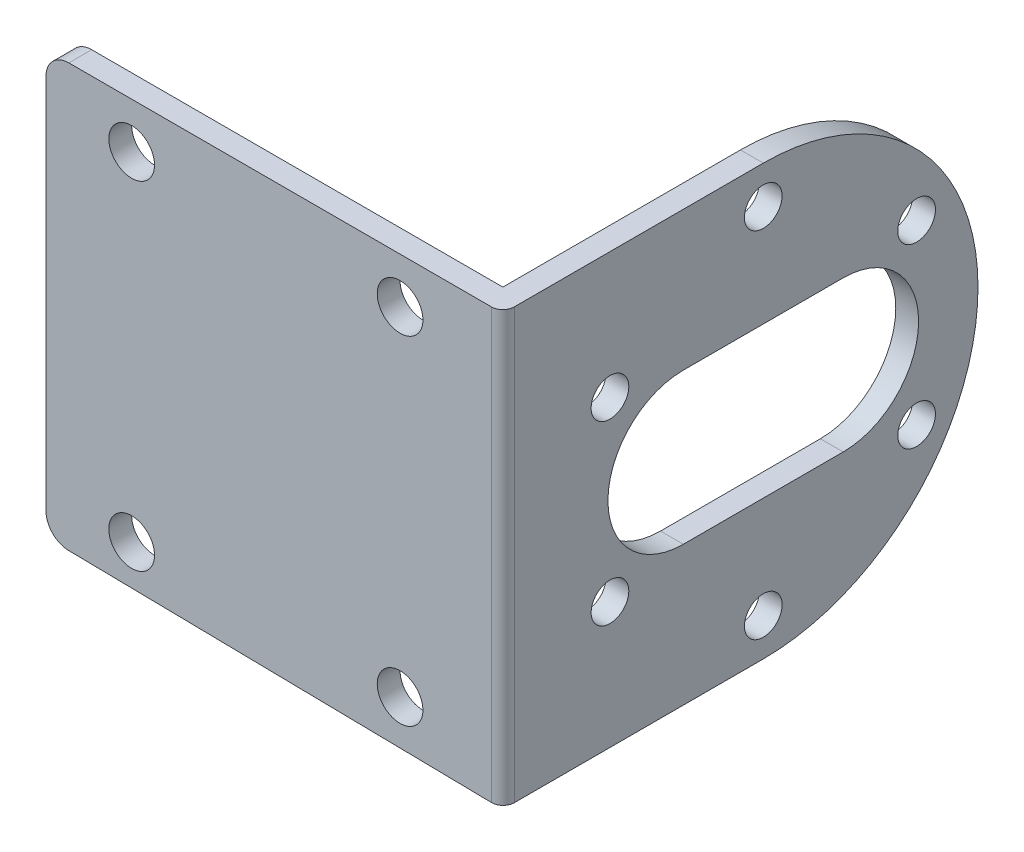
ISO-10303-21;
HEADER;
FILE_DESCRIPTION(('STEP AP214'),'2;1');
FILE_NAME('part.step','',(''),(''),'','','');
FILE_SCHEMA(('AUTOMOTIVE_DESIGN { 1 0 10303 214 1 1 1 1 }'));
ENDSEC;
DATA;
#1=APPLICATION_CONTEXT('core data for automotive mechanical design processes');
#2=APPLICATION_PROTOCOL_DEFINITION('international standard','automotive_design',2000,#1);
#3=PRODUCT_CONTEXT('',#1,'mechanical');
#4=PRODUCT('Part','Part','',(#3));
#5=PRODUCT_RELATED_PRODUCT_CATEGORY('part','',(#4));
#6=PRODUCT_DEFINITION_FORMATION('','',#4);
#7=PRODUCT_DEFINITION_CONTEXT('part definition',#1,'design');
#8=PRODUCT_DEFINITION('design','',#6,#7);
#9=PRODUCT_DEFINITION_SHAPE('','',#8);
#10=(LENGTH_UNIT() NAMED_UNIT(*) SI_UNIT(.MILLI.,.METRE.));
#11=(NAMED_UNIT(*) PLANE_ANGLE_UNIT() SI_UNIT($,.RADIAN.));
#12=(NAMED_UNIT(*) SI_UNIT($,.STERADIAN.) SOLID_ANGLE_UNIT());
#13=UNCERTAINTY_MEASURE_WITH_UNIT(LENGTH_MEASURE(1.E-05),#10,'distance_accuracy_value','');
#14=(GEOMETRIC_REPRESENTATION_CONTEXT(3) GLOBAL_UNCERTAINTY_ASSIGNED_CONTEXT((#13)) GLOBAL_UNIT_ASSIGNED_CONTEXT((#10,
#11,#12)) REPRESENTATION_CONTEXT('',''));
#15=CARTESIAN_POINT('',(0.,0.,0.));
#16=DIRECTION('',(0.,0.,1.));
#17=DIRECTION('',(1.,0.,0.));
#18=AXIS2_PLACEMENT_3D('',#15,#16,#17);
#19=CARTESIAN_POINT('',(2.,-18.8,20.8));
#20=DIRECTION('',(0.,0.,-1.));
#21=DIRECTION('',(-1.,0.,0.));
#22=AXIS2_PLACEMENT_3D('',#19,#20,#21);
#23=PLANE('',#22);
#24=DIRECTION('',(0.999868239788171,-0.0162327774242085,0.));
#25=VECTOR('',#24,1.);
#26=CARTESIAN_POINT('',(2.,-18.8,20.8));
#27=LINE('',#26,#25);
#28=CARTESIAN_POINT('',(0.,-18.7675301669195,20.8));
#29=VERTEX_POINT('',#28);
#30=CARTESIAN_POINT('',(2.,-18.8,20.8));
#31=VERTEX_POINT('',#30);
#32=EDGE_CURVE('E167',#29,#31,#27,.T.);
#33=ORIENTED_EDGE('',*,*,#32,.F.);
#34=DIRECTION('',(0.,-1.,0.));
#35=VECTOR('',#34,1.);
#36=CARTESIAN_POINT('',(0.,-18.8,20.8));
#37=LINE('',#36,#35);
#38=CARTESIAN_POINT('',(0.,-18.8,20.8));
#39=VERTEX_POINT('',#38);
#40=EDGE_CURVE('E169',#29,#39,#37,.T.);
#41=ORIENTED_EDGE('',*,*,#40,.T.);
#42=DIRECTION('',(-1.,0.,0.));
#43=VECTOR('',#42,1.);
#44=CARTESIAN_POINT('',(2.,-18.8,20.8));
#45=LINE('',#44,#43);
#46=EDGE_CURVE('E158',#31,#39,#45,.T.);
#47=ORIENTED_EDGE('',*,*,#46,.F.);
#48=EDGE_LOOP('',(#33,#41,#47));
#49=FACE_BOUND('',#48,.T.);
#50=ADVANCED_FACE('F32',(#49),#23,.F.);
#51=CARTESIAN_POINT('',(2.,0.,0.));
#52=DIRECTION('',(-1.,0.,0.));
#53=DIRECTION('',(0.,0.,1.));
#54=AXIS2_PLACEMENT_3D('',#51,#52,#53);
#55=PLANE('',#54);
#56=CARTESIAN_POINT('',(2.,15.5,-1.57859836313889E-13));
#57=DIRECTION('',(1.,0.,0.));
#58=DIRECTION('',(0.,0.,-1.));
#59=AXIS2_PLACEMENT_3D('',#56,#57,#58);
#60=CIRCLE('',#59,1.65);
#61=CARTESIAN_POINT('',(2.,15.5,-1.65000000000016));
#62=VERTEX_POINT('',#61);
#63=EDGE_CURVE('E311',#62,#62,#60,.T.);
#64=ORIENTED_EDGE('',*,*,#63,.F.);
#65=EDGE_LOOP('',(#64));
#66=FACE_BOUND('',#65,.T.);
#67=CARTESIAN_POINT('',(2.,7.74999999999885,13.4233937586588));
#68=DIRECTION('',(1.,0.,0.));
#69=DIRECTION('',(0.,0.,-1.));
#70=AXIS2_PLACEMENT_3D('',#67,#68,#69);
#71=CIRCLE('',#70,1.65000000000079);
#72=CARTESIAN_POINT('',(2.,7.74999999999885,11.773393758658));
#73=VERTEX_POINT('',#72);
#74=EDGE_CURVE('E305',#73,#73,#71,.T.);
#75=ORIENTED_EDGE('',*,*,#74,.F.);
#76=EDGE_LOOP('',(#75));
#77=FACE_BOUND('',#76,.T.);
#78=CARTESIAN_POINT('',(2.,-7.75000000000115,13.4233937586581));
#79=DIRECTION('',(1.,0.,0.));
#80=DIRECTION('',(0.,0.,-1.));
#81=AXIS2_PLACEMENT_3D('',#78,#79,#80);
#82=CIRCLE('',#81,1.65000000000032);
#83=CARTESIAN_POINT('',(2.,-7.75000000000115,11.7733937586578));
#84=VERTEX_POINT('',#83);
#85=EDGE_CURVE('E299',#84,#84,#82,.T.);
#86=ORIENTED_EDGE('',*,*,#85,.F.);
#87=EDGE_LOOP('',(#86));
#88=FACE_BOUND('',#87,.T.);
#89=CARTESIAN_POINT('',(2.,-15.5000000000006,-9.97625993666009E-13));
#90=DIRECTION('',(1.,0.,0.));
#91=DIRECTION('',(0.,0.,-1.));
#92=AXIS2_PLACEMENT_3D('',#89,#90,#91);
#93=CIRCLE('',#92,1.64999999999969);
#94=CARTESIAN_POINT('',(2.,-15.5000000000006,-1.65000000000069));
#95=VERTEX_POINT('',#94);
#96=EDGE_CURVE('E293',#95,#95,#93,.T.);
#97=ORIENTED_EDGE('',*,*,#96,.F.);
#98=EDGE_LOOP('',(#97));
#99=FACE_BOUND('',#98,.T.);
#100=CARTESIAN_POINT('',(2.,-7.75000000000001,-13.4233937586588));
#101=DIRECTION('',(1.,0.,0.));
#102=DIRECTION('',(0.,0.,-1.));
#103=AXIS2_PLACEMENT_3D('',#100,#101,#102);
#104=CIRCLE('',#103,1.65);
#105=CARTESIAN_POINT('',(2.,-7.75000000000001,-15.0733937586588));
#106=VERTEX_POINT('',#105);
#107=EDGE_CURVE('E287',#106,#106,#104,.T.);
#108=ORIENTED_EDGE('',*,*,#107,.F.);
#109=EDGE_LOOP('',(#108));
#110=FACE_BOUND('',#109,.T.);
#111=CARTESIAN_POINT('',(2.,7.75000000000002,-13.4233937586588));
#112=DIRECTION('',(1.,0.,0.));
#113=DIRECTION('',(0.,0.,-1.));
#114=AXIS2_PLACEMENT_3D('',#111,#112,#113);
#115=CIRCLE('',#114,1.65);
#116=CARTESIAN_POINT('',(2.,7.75000000000002,-15.0733937586588));
#117=VERTEX_POINT('',#116);
#118=EDGE_CURVE('E280',#117,#117,#115,.T.);
#119=ORIENTED_EDGE('',*,*,#118,.F.);
#120=EDGE_LOOP('',(#119));
#121=FACE_BOUND('',#120,.T.);
#122=DIRECTION('',(0.,0.,1.));
#123=VECTOR('',#122,1.);
#124=CARTESIAN_POINT('',(2.,18.8,0.));
#125=LINE('',#124,#123);
#126=CARTESIAN_POINT('',(2.,18.8,0.));
#127=VERTEX_POINT('',#126);
#128=CARTESIAN_POINT('',(2.,18.8,21.8));
#129=VERTEX_POINT('',#128);
#130=EDGE_CURVE('E163',#127,#129,#125,.T.);
#131=ORIENTED_EDGE('',*,*,#130,.T.);
#132=DIRECTION('',(0.,1.,0.));
#133=VECTOR('',#132,1.);
#134=CARTESIAN_POINT('',(2.,0.,21.8));
#135=LINE('',#134,#133);
#136=CARTESIAN_POINT('',(2.,-18.8,21.8));
#137=VERTEX_POINT('',#136);
#138=EDGE_CURVE('E146',#129,#137,#135,.F.);
#139=ORIENTED_EDGE('',*,*,#138,.T.);
#140=DIRECTION('',(0.,0.,-1.));
#141=VECTOR('',#140,1.);
#142=CARTESIAN_POINT('',(2.,-18.8,22.8));
#143=LINE('',#142,#141);
#144=EDGE_CURVE('E137',#137,#31,#143,.T.);
#145=ORIENTED_EDGE('',*,*,#144,.T.);
#146=DIRECTION('',(0.,0.,-1.));
#147=VECTOR('',#146,1.);
#148=CARTESIAN_POINT('',(2.,-18.8,0.));
#149=LINE('',#148,#147);
#150=CARTESIAN_POINT('',(2.,-18.8,0.));
#151=VERTEX_POINT('',#150);
#152=EDGE_CURVE('E143',#31,#151,#149,.T.);
#153=ORIENTED_EDGE('',*,*,#152,.T.);
#154=CARTESIAN_POINT('',(2.,0.,0.));
#155=DIRECTION('',(1.,0.,0.));
#156=DIRECTION('',(0.,0.,1.));
#157=AXIS2_PLACEMENT_3D('',#154,#155,#156);
#158=CIRCLE('',#157,18.8);
#159=EDGE_CURVE('E273',#151,#127,#158,.T.);
#160=ORIENTED_EDGE('',*,*,#159,.T.);
#161=EDGE_LOOP('',(#131,#139,#145,#153,#160));
#162=FACE_BOUND('',#161,.T.);
#163=CARTESIAN_POINT('',(2.,0.,7.));
#164=DIRECTION('',(1.,0.,0.));
#165=DIRECTION('',(0.,0.,-1.));
#166=AXIS2_PLACEMENT_3D('',#163,#164,#165);
#167=CIRCLE('',#166,6.6);
#168=CARTESIAN_POINT('',(2.,6.6,7.));
#169=VERTEX_POINT('',#168);
#170=CARTESIAN_POINT('',(2.,-6.6,7.));
#171=VERTEX_POINT('',#170);
#172=EDGE_CURVE('E333',#169,#171,#167,.T.);
#173=ORIENTED_EDGE('',*,*,#172,.F.);
#174=DIRECTION('',(0.,0.,1.));
#175=VECTOR('',#174,1.);
#176=CARTESIAN_POINT('',(2.,6.6,7.));
#177=LINE('',#176,#175);
#178=CARTESIAN_POINT('',(2.,6.6,-7.));
#179=VERTEX_POINT('',#178);
#180=EDGE_CURVE('E329',#179,#169,#177,.T.);
#181=ORIENTED_EDGE('',*,*,#180,.F.);
#182=CARTESIAN_POINT('',(2.,0.,-7.));
#183=DIRECTION('',(1.,0.,0.));
#184=DIRECTION('',(0.,0.,-1.));
#185=AXIS2_PLACEMENT_3D('',#182,#183,#184);
#186=CIRCLE('',#185,6.6);
#187=CARTESIAN_POINT('',(2.,-6.6,-7.));
#188=VERTEX_POINT('',#187);
#189=EDGE_CURVE('E343',#188,#179,#186,.T.);
#190=ORIENTED_EDGE('',*,*,#189,.F.);
#191=DIRECTION('',(0.,0.,-1.));
#192=VECTOR('',#191,1.);
#193=CARTESIAN_POINT('',(2.,-6.6,7.));
#194=LINE('',#193,#192);
#195=EDGE_CURVE('E346',#171,#188,#194,.T.);
#196=ORIENTED_EDGE('',*,*,#195,.F.);
#197=EDGE_LOOP('',(#173,#181,#190,#196));
#198=FACE_BOUND('',#197,.T.);
#199=ADVANCED_FACE('F140',(#66,#77,#88,#99,#110,#121,#162,#198),#55,.F.);
#200=CARTESIAN_POINT('',(0.,0.,0.));
#201=DIRECTION('',(-1.,0.,0.));
#202=DIRECTION('',(0.,0.,1.));
#203=AXIS2_PLACEMENT_3D('',#200,#201,#202);
#204=PLANE('',#203);
#205=CARTESIAN_POINT('',(0.,7.74999999999885,13.4233937586588));
#206=DIRECTION('',(1.,0.,0.));
#207=DIRECTION('',(0.,0.,-1.));
#208=AXIS2_PLACEMENT_3D('',#205,#206,#207);
#209=CIRCLE('',#208,1.65000000000079);
#210=CARTESIAN_POINT('',(0.,7.74999999999885,11.773393758658));
#211=VERTEX_POINT('',#210);
#212=EDGE_CURVE('E308',#211,#211,#209,.T.);
#213=ORIENTED_EDGE('',*,*,#212,.T.);
#214=EDGE_LOOP('',(#213));
#215=FACE_BOUND('',#214,.T.);
#216=CARTESIAN_POINT('',(0.,-15.5000000000006,-9.97625993666009E-13));
#217=DIRECTION('',(1.,0.,0.));
#218=DIRECTION('',(0.,0.,-1.));
#219=AXIS2_PLACEMENT_3D('',#216,#217,#218);
#220=CIRCLE('',#219,1.64999999999969);
#221=CARTESIAN_POINT('',(0.,-15.5000000000006,-1.65000000000069));
#222=VERTEX_POINT('',#221);
#223=EDGE_CURVE('E296',#222,#222,#220,.T.);
#224=ORIENTED_EDGE('',*,*,#223,.T.);
#225=EDGE_LOOP('',(#224));
#226=FACE_BOUND('',#225,.T.);
#227=CARTESIAN_POINT('',(0.,7.75000000000002,-13.4233937586588));
#228=DIRECTION('',(1.,0.,0.));
#229=DIRECTION('',(0.,0.,-1.));
#230=AXIS2_PLACEMENT_3D('',#227,#228,#229);
#231=CIRCLE('',#230,1.65);
#232=CARTESIAN_POINT('',(0.,7.75000000000002,-15.0733937586588));
#233=VERTEX_POINT('',#232);
#234=EDGE_CURVE('E284',#233,#233,#231,.T.);
#235=ORIENTED_EDGE('',*,*,#234,.T.);
#236=EDGE_LOOP('',(#235));
#237=FACE_BOUND('',#236,.T.);
#238=CARTESIAN_POINT('',(0.,0.,0.));
#239=DIRECTION('',(1.,0.,0.));
#240=DIRECTION('',(0.,0.,1.));
#241=AXIS2_PLACEMENT_3D('',#238,#239,#240);
#242=CIRCLE('',#241,18.8);
#243=CARTESIAN_POINT('',(0.,-18.8,0.));
#244=VERTEX_POINT('',#243);
#245=CARTESIAN_POINT('',(0.,18.8,0.));
#246=VERTEX_POINT('',#245);
#247=EDGE_CURVE('E278',#244,#246,#242,.T.);
#248=ORIENTED_EDGE('',*,*,#247,.F.);
#249=DIRECTION('',(0.,0.,-1.));
#250=VECTOR('',#249,1.);
#251=CARTESIAN_POINT('',(0.,-18.8,0.));
#252=LINE('',#251,#250);
#253=EDGE_CURVE('E271',#39,#244,#252,.T.);
#254=ORIENTED_EDGE('',*,*,#253,.F.);
#255=ORIENTED_EDGE('',*,*,#40,.F.);
#256=CARTESIAN_POINT('',(0.,18.8,20.8));
#257=VERTEX_POINT('',#256);
#258=EDGE_CURVE('E274',#257,#29,#37,.T.);
#259=ORIENTED_EDGE('',*,*,#258,.F.);
#260=DIRECTION('',(0.,0.,1.));
#261=VECTOR('',#260,1.);
#262=CARTESIAN_POINT('',(0.,18.8,0.));
#263=LINE('',#262,#261);
#264=EDGE_CURVE('E276',#246,#257,#263,.T.);
#265=ORIENTED_EDGE('',*,*,#264,.F.);
#266=EDGE_LOOP('',(#248,#254,#255,#259,#265));
#267=FACE_BOUND('',#266,.T.);
#268=CARTESIAN_POINT('',(0.,-7.75000000000001,-13.4233937586588));
#269=DIRECTION('',(1.,0.,0.));
#270=DIRECTION('',(0.,0.,-1.));
#271=AXIS2_PLACEMENT_3D('',#268,#269,#270);
#272=CIRCLE('',#271,1.65);
#273=CARTESIAN_POINT('',(0.,-7.75000000000001,-15.0733937586588));
#274=VERTEX_POINT('',#273);
#275=EDGE_CURVE('E290',#274,#274,#272,.T.);
#276=ORIENTED_EDGE('',*,*,#275,.T.);
#277=EDGE_LOOP('',(#276));
#278=FACE_BOUND('',#277,.T.);
#279=CARTESIAN_POINT('',(0.,-7.75000000000115,13.4233937586581));
#280=DIRECTION('',(1.,0.,0.));
#281=DIRECTION('',(0.,0.,-1.));
#282=AXIS2_PLACEMENT_3D('',#279,#280,#281);
#283=CIRCLE('',#282,1.65000000000032);
#284=CARTESIAN_POINT('',(0.,-7.75000000000115,11.7733937586578));
#285=VERTEX_POINT('',#284);
#286=EDGE_CURVE('E302',#285,#285,#283,.T.);
#287=ORIENTED_EDGE('',*,*,#286,.T.);
#288=EDGE_LOOP('',(#287));
#289=FACE_BOUND('',#288,.T.);
#290=CARTESIAN_POINT('',(0.,15.5,-1.57859836313889E-13));
#291=DIRECTION('',(1.,0.,0.));
#292=DIRECTION('',(0.,0.,-1.));
#293=AXIS2_PLACEMENT_3D('',#290,#291,#292);
#294=CIRCLE('',#293,1.65);
#295=CARTESIAN_POINT('',(0.,15.5,-1.65000000000016));
#296=VERTEX_POINT('',#295);
#297=EDGE_CURVE('E314',#296,#296,#294,.T.);
#298=ORIENTED_EDGE('',*,*,#297,.T.);
#299=EDGE_LOOP('',(#298));
#300=FACE_BOUND('',#299,.T.);
#301=DIRECTION('',(0.,0.,1.));
#302=VECTOR('',#301,1.);
#303=CARTESIAN_POINT('',(0.,6.6,7.));
#304=LINE('',#303,#302);
#305=CARTESIAN_POINT('',(0.,6.6,-7.));
#306=VERTEX_POINT('',#305);
#307=CARTESIAN_POINT('',(0.,6.6,7.));
#308=VERTEX_POINT('',#307);
#309=EDGE_CURVE('E330',#306,#308,#304,.T.);
#310=ORIENTED_EDGE('',*,*,#309,.T.);
#311=CARTESIAN_POINT('',(0.,0.,7.));
#312=DIRECTION('',(1.,0.,0.));
#313=DIRECTION('',(0.,0.,-1.));
#314=AXIS2_PLACEMENT_3D('',#311,#312,#313);
#315=CIRCLE('',#314,6.6);
#316=CARTESIAN_POINT('',(0.,-6.6,7.));
#317=VERTEX_POINT('',#316);
#318=EDGE_CURVE('E151',#308,#317,#315,.T.);
#319=ORIENTED_EDGE('',*,*,#318,.T.);
#320=DIRECTION('',(0.,0.,-1.));
#321=VECTOR('',#320,1.);
#322=CARTESIAN_POINT('',(0.,-6.6,7.));
#323=LINE('',#322,#321);
#324=CARTESIAN_POINT('',(0.,-6.6,-7.));
#325=VERTEX_POINT('',#324);
#326=EDGE_CURVE('E337',#317,#325,#323,.T.);
#327=ORIENTED_EDGE('',*,*,#326,.T.);
#328=CARTESIAN_POINT('',(0.,0.,-7.));
#329=DIRECTION('',(1.,0.,0.));
#330=DIRECTION('',(0.,0.,-1.));
#331=AXIS2_PLACEMENT_3D('',#328,#329,#330);
#332=CIRCLE('',#331,6.6);
#333=EDGE_CURVE('E334',#325,#306,#332,.T.);
#334=ORIENTED_EDGE('',*,*,#333,.T.);
#335=EDGE_LOOP('',(#310,#319,#327,#334));
#336=FACE_BOUND('',#335,.T.);
#337=ADVANCED_FACE('F364',(#215,#226,#237,#267,#278,#289,#300,#336),#204,.T.);
#338=CARTESIAN_POINT('',(2.,0.,0.));
#339=DIRECTION('',(-1.,0.,0.));
#340=DIRECTION('',(0.,0.,1.));
#341=AXIS2_PLACEMENT_3D('',#338,#339,#340);
#342=CYLINDRICAL_SURFACE('',#341,18.8);
#343=ORIENTED_EDGE('',*,*,#247,.T.);
#344=DIRECTION('',(-1.,0.,0.));
#345=VECTOR('',#344,1.);
#346=CARTESIAN_POINT('',(2.,18.8,0.));
#347=LINE('',#346,#345);
#348=EDGE_CURVE('E170',#127,#246,#347,.T.);
#349=ORIENTED_EDGE('',*,*,#348,.F.);
#350=ORIENTED_EDGE('',*,*,#159,.F.);
#351=DIRECTION('',(-1.,0.,0.));
#352=VECTOR('',#351,1.);
#353=CARTESIAN_POINT('',(2.,-18.8,0.));
#354=LINE('',#353,#352);
#355=EDGE_CURVE('E161',#151,#244,#354,.T.);
#356=ORIENTED_EDGE('',*,*,#355,.T.);
#357=EDGE_LOOP('',(#343,#349,#350,#356));
#358=FACE_BOUND('',#357,.T.);
#359=ADVANCED_FACE('F389',(#358),#342,.T.);
#360=CARTESIAN_POINT('',(2.,18.8,0.));
#361=DIRECTION('',(0.,-1.,0.));
#362=DIRECTION('',(0.,0.,-1.));
#363=AXIS2_PLACEMENT_3D('',#360,#361,#362);
#364=PLANE('',#363);
#365=DIRECTION('',(-1.,0.,0.));
#366=VECTOR('',#365,1.);
#367=CARTESIAN_POINT('',(2.,18.8,20.8));
#368=LINE('',#367,#366);
#369=CARTESIAN_POINT('',(-36.,18.8,20.8));
#370=VERTEX_POINT('',#369);
#371=EDGE_CURVE('E188',#257,#370,#368,.T.);
#372=ORIENTED_EDGE('',*,*,#371,.T.);
#373=DIRECTION('',(0.,0.,-1.));
#374=VECTOR('',#373,1.);
#375=CARTESIAN_POINT('',(-36.,18.8,0.));
#376=LINE('',#375,#374);
#377=CARTESIAN_POINT('',(-36.,18.8,22.8));
#378=VERTEX_POINT('',#377);
#379=EDGE_CURVE('E57',#370,#378,#376,.F.);
#380=ORIENTED_EDGE('',*,*,#379,.T.);
#381=DIRECTION('',(-1.,0.,0.));
#382=VECTOR('',#381,1.);
#383=CARTESIAN_POINT('',(2.,18.8,22.8));
#384=LINE('',#383,#382);
#385=CARTESIAN_POINT('',(1.,18.8,22.8));
#386=VERTEX_POINT('',#385);
#387=EDGE_CURVE('E183',#386,#378,#384,.T.);
#388=ORIENTED_EDGE('',*,*,#387,.F.);
#389=CARTESIAN_POINT('',(1.,18.8,21.8));
#390=DIRECTION('',(0.,-1.,0.));
#391=DIRECTION('',(0.,0.,-1.));
#392=AXIS2_PLACEMENT_3D('',#389,#390,#391);
#393=CIRCLE('',#392,1.);
#394=EDGE_CURVE('E178',#386,#129,#393,.F.);
#395=ORIENTED_EDGE('',*,*,#394,.T.);
#396=ORIENTED_EDGE('',*,*,#130,.F.);
#397=ORIENTED_EDGE('',*,*,#348,.T.);
#398=ORIENTED_EDGE('',*,*,#264,.T.);
#399=EDGE_LOOP('',(#372,#380,#388,#395,#396,#397,#398));
#400=FACE_BOUND('',#399,.T.);
#401=ADVANCED_FACE('F386',(#400),#364,.F.);
#402=CARTESIAN_POINT('',(2.,-18.8,0.));
#403=DIRECTION('',(0.,1.,0.));
#404=DIRECTION('',(0.,0.,1.));
#405=AXIS2_PLACEMENT_3D('',#402,#403,#404);
#406=PLANE('',#405);
#407=ORIENTED_EDGE('',*,*,#253,.T.);
#408=ORIENTED_EDGE('',*,*,#355,.F.);
#409=ORIENTED_EDGE('',*,*,#152,.F.);
#410=ORIENTED_EDGE('',*,*,#46,.T.);
#411=EDGE_LOOP('',(#407,#408,#409,#410));
#412=FACE_BOUND('',#411,.T.);
#413=ADVANCED_FACE('F157',(#412),#406,.F.);
#414=CARTESIAN_POINT('',(2.,7.75000000000002,-13.4233937586588));
#415=DIRECTION('',(-1.,0.,0.));
#416=DIRECTION('',(0.,0.,1.));
#417=AXIS2_PLACEMENT_3D('',#414,#415,#416);
#418=CYLINDRICAL_SURFACE('',#417,1.65);
#419=ORIENTED_EDGE('',*,*,#118,.T.);
#420=EDGE_LOOP('',(#419));
#421=FACE_BOUND('',#420,.T.);
#422=ORIENTED_EDGE('',*,*,#234,.F.);
#423=EDGE_LOOP('',(#422));
#424=FACE_BOUND('',#423,.T.);
#425=ADVANCED_FACE('F443',(#421,#424),#418,.F.);
#426=CARTESIAN_POINT('',(2.,-7.75000000000001,-13.4233937586588));
#427=DIRECTION('',(-1.,0.,0.));
#428=DIRECTION('',(0.,0.,1.));
#429=AXIS2_PLACEMENT_3D('',#426,#427,#428);
#430=CYLINDRICAL_SURFACE('',#429,1.65);
#431=ORIENTED_EDGE('',*,*,#107,.T.);
#432=EDGE_LOOP('',(#431));
#433=FACE_BOUND('',#432,.T.);
#434=ORIENTED_EDGE('',*,*,#275,.F.);
#435=EDGE_LOOP('',(#434));
#436=FACE_BOUND('',#435,.T.);
#437=ADVANCED_FACE('F439',(#433,#436),#430,.F.);
#438=CARTESIAN_POINT('',(2.,-15.5000000000006,-9.97625993666009E-13));
#439=DIRECTION('',(-1.,0.,0.));
#440=DIRECTION('',(0.,0.,1.));
#441=AXIS2_PLACEMENT_3D('',#438,#439,#440);
#442=CYLINDRICAL_SURFACE('',#441,1.64999999999969);
#443=ORIENTED_EDGE('',*,*,#96,.T.);
#444=EDGE_LOOP('',(#443));
#445=FACE_BOUND('',#444,.T.);
#446=ORIENTED_EDGE('',*,*,#223,.F.);
#447=EDGE_LOOP('',(#446));
#448=FACE_BOUND('',#447,.T.);
#449=ADVANCED_FACE('F435',(#445,#448),#442,.F.);
#450=CARTESIAN_POINT('',(2.,-7.75000000000115,13.4233937586581));
#451=DIRECTION('',(-1.,0.,0.));
#452=DIRECTION('',(0.,0.,1.));
#453=AXIS2_PLACEMENT_3D('',#450,#451,#452);
#454=CYLINDRICAL_SURFACE('',#453,1.65000000000032);
#455=ORIENTED_EDGE('',*,*,#85,.T.);
#456=EDGE_LOOP('',(#455));
#457=FACE_BOUND('',#456,.T.);
#458=ORIENTED_EDGE('',*,*,#286,.F.);
#459=EDGE_LOOP('',(#458));
#460=FACE_BOUND('',#459,.T.);
#461=ADVANCED_FACE('F428',(#457,#460),#454,.F.);
#462=CARTESIAN_POINT('',(2.,7.74999999999885,13.4233937586588));
#463=DIRECTION('',(-1.,0.,0.));
#464=DIRECTION('',(0.,0.,1.));
#465=AXIS2_PLACEMENT_3D('',#462,#463,#464);
#466=CYLINDRICAL_SURFACE('',#465,1.65000000000079);
#467=ORIENTED_EDGE('',*,*,#74,.T.);
#468=EDGE_LOOP('',(#467));
#469=FACE_BOUND('',#468,.T.);
#470=ORIENTED_EDGE('',*,*,#212,.F.);
#471=EDGE_LOOP('',(#470));
#472=FACE_BOUND('',#471,.T.);
#473=ADVANCED_FACE('F420',(#469,#472),#466,.F.);
#474=CARTESIAN_POINT('',(2.,15.5,-1.57859836313889E-13));
#475=DIRECTION('',(-1.,0.,0.));
#476=DIRECTION('',(0.,0.,1.));
#477=AXIS2_PLACEMENT_3D('',#474,#475,#476);
#478=CYLINDRICAL_SURFACE('',#477,1.65);
#479=ORIENTED_EDGE('',*,*,#63,.T.);
#480=EDGE_LOOP('',(#479));
#481=FACE_BOUND('',#480,.T.);
#482=ORIENTED_EDGE('',*,*,#297,.F.);
#483=EDGE_LOOP('',(#482));
#484=FACE_BOUND('',#483,.T.);
#485=ADVANCED_FACE('F418',(#481,#484),#478,.F.);
#486=CARTESIAN_POINT('',(2.,0.,7.));
#487=DIRECTION('',(-1.,0.,0.));
#488=DIRECTION('',(0.,0.,1.));
#489=AXIS2_PLACEMENT_3D('',#486,#487,#488);
#490=CYLINDRICAL_SURFACE('',#489,6.6);
#491=ORIENTED_EDGE('',*,*,#318,.F.);
#492=DIRECTION('',(-1.,0.,0.));
#493=VECTOR('',#492,1.);
#494=CARTESIAN_POINT('',(2.,6.6,7.));
#495=LINE('',#494,#493);
#496=EDGE_CURVE('E326',#169,#308,#495,.T.);
#497=ORIENTED_EDGE('',*,*,#496,.F.);
#498=ORIENTED_EDGE('',*,*,#172,.T.);
#499=DIRECTION('',(-1.,0.,0.));
#500=VECTOR('',#499,1.);
#501=CARTESIAN_POINT('',(2.,-6.6,7.));
#502=LINE('',#501,#500);
#503=EDGE_CURVE('E317',#171,#317,#502,.T.);
#504=ORIENTED_EDGE('',*,*,#503,.T.);
#505=EDGE_LOOP('',(#491,#497,#498,#504));
#506=FACE_BOUND('',#505,.T.);
#507=ADVANCED_FACE('F352',(#506),#490,.F.);
#508=CARTESIAN_POINT('',(2.,-6.6,7.));
#509=DIRECTION('',(0.,1.,0.));
#510=DIRECTION('',(0.,0.,1.));
#511=AXIS2_PLACEMENT_3D('',#508,#509,#510);
#512=PLANE('',#511);
#513=ORIENTED_EDGE('',*,*,#326,.F.);
#514=ORIENTED_EDGE('',*,*,#503,.F.);
#515=ORIENTED_EDGE('',*,*,#195,.T.);
#516=DIRECTION('',(-1.,0.,0.));
#517=VECTOR('',#516,1.);
#518=CARTESIAN_POINT('',(2.,-6.6,-7.));
#519=LINE('',#518,#517);
#520=EDGE_CURVE('E322',#188,#325,#519,.T.);
#521=ORIENTED_EDGE('',*,*,#520,.T.);
#522=EDGE_LOOP('',(#513,#514,#515,#521));
#523=FACE_BOUND('',#522,.T.);
#524=ADVANCED_FACE('F356',(#523),#512,.T.);
#525=CARTESIAN_POINT('',(2.,0.,-7.));
#526=DIRECTION('',(-1.,0.,0.));
#527=DIRECTION('',(0.,0.,1.));
#528=AXIS2_PLACEMENT_3D('',#525,#526,#527);
#529=CYLINDRICAL_SURFACE('',#528,6.6);
#530=ORIENTED_EDGE('',*,*,#333,.F.);
#531=ORIENTED_EDGE('',*,*,#520,.F.);
#532=ORIENTED_EDGE('',*,*,#189,.T.);
#533=DIRECTION('',(-1.,0.,0.));
#534=VECTOR('',#533,1.);
#535=CARTESIAN_POINT('',(2.,6.6,-7.));
#536=LINE('',#535,#534);
#537=EDGE_CURVE('E324',#179,#306,#536,.T.);
#538=ORIENTED_EDGE('',*,*,#537,.T.);
#539=EDGE_LOOP('',(#530,#531,#532,#538));
#540=FACE_BOUND('',#539,.T.);
#541=ADVANCED_FACE('F361',(#540),#529,.F.);
#542=CARTESIAN_POINT('',(2.,6.6,7.));
#543=DIRECTION('',(0.,-1.,0.));
#544=DIRECTION('',(0.,0.,-1.));
#545=AXIS2_PLACEMENT_3D('',#542,#543,#544);
#546=PLANE('',#545);
#547=ORIENTED_EDGE('',*,*,#309,.F.);
#548=ORIENTED_EDGE('',*,*,#537,.F.);
#549=ORIENTED_EDGE('',*,*,#180,.T.);
#550=ORIENTED_EDGE('',*,*,#496,.T.);
#551=EDGE_LOOP('',(#547,#548,#549,#550));
#552=FACE_BOUND('',#551,.T.);
#553=ADVANCED_FACE('F366',(#552),#546,.T.);
#554=CARTESIAN_POINT('',(-38.,-18.15060333839,22.8));
#555=DIRECTION('',(1.,0.,0.));
#556=DIRECTION('',(0.,0.,-1.));
#557=AXIS2_PLACEMENT_3D('',#554,#555,#556);
#558=PLANE('',#557);
#559=DIRECTION('',(0.,-1.,0.));
#560=VECTOR('',#559,1.);
#561=CARTESIAN_POINT('',(-38.,-18.15060333839,22.8));
#562=LINE('',#561,#560);
#563=CARTESIAN_POINT('',(-38.,16.8,22.8));
#564=VERTEX_POINT('',#563);
#565=CARTESIAN_POINT('',(-38.,-16.1828096163207,22.8));
#566=VERTEX_POINT('',#565);
#567=EDGE_CURVE('E185',#564,#566,#562,.T.);
#568=ORIENTED_EDGE('',*,*,#567,.F.);
#569=DIRECTION('',(0.,0.,-1.));
#570=VECTOR('',#569,1.);
#571=CARTESIAN_POINT('',(-38.,16.8,22.8));
#572=LINE('',#571,#570);
#573=CARTESIAN_POINT('',(-38.,16.8,20.8));
#574=VERTEX_POINT('',#573);
#575=EDGE_CURVE('E226',#564,#574,#572,.T.);
#576=ORIENTED_EDGE('',*,*,#575,.T.);
#577=DIRECTION('',(0.,-1.,0.));
#578=VECTOR('',#577,1.);
#579=CARTESIAN_POINT('',(-38.,-18.15060333839,20.8));
#580=LINE('',#579,#578);
#581=CARTESIAN_POINT('',(-38.,-16.1828096163207,20.8));
#582=VERTEX_POINT('',#581);
#583=EDGE_CURVE('E184',#574,#582,#580,.T.);
#584=ORIENTED_EDGE('',*,*,#583,.T.);
#585=DIRECTION('',(0.,0.,-1.));
#586=VECTOR('',#585,1.);
#587=CARTESIAN_POINT('',(-38.,-16.1828096163207,22.8));
#588=LINE('',#587,#586);
#589=EDGE_CURVE('E262',#582,#566,#588,.F.);
#590=ORIENTED_EDGE('',*,*,#589,.T.);
#591=EDGE_LOOP('',(#568,#576,#584,#590));
#592=FACE_BOUND('',#591,.T.);
#593=ADVANCED_FACE('F368',(#592),#558,.F.);
#594=CARTESIAN_POINT('',(2.,-18.8,22.8));
#595=DIRECTION('',(0.0162327774242085,0.999868239788171,0.));
#596=DIRECTION('',(-0.999868239788171,0.0162327774242085,0.));
#597=AXIS2_PLACEMENT_3D('',#594,#595,#596);
#598=PLANE('',#597);
#599=DIRECTION('',(0.999868239788171,-0.0162327774242085,0.));
#600=VECTOR('',#599,1.);
#601=CARTESIAN_POINT('',(2.,-18.8,22.8));
#602=LINE('',#601,#600);
#603=CARTESIAN_POINT('',(-36.0324655548484,-18.1825460958971,22.8));
#604=VERTEX_POINT('',#603);
#605=CARTESIAN_POINT('',(1.,-18.7837650834598,22.8));
#606=VERTEX_POINT('',#605);
#607=EDGE_CURVE('E152',#604,#606,#602,.T.);
#608=ORIENTED_EDGE('',*,*,#607,.F.);
#609=DIRECTION('',(0.,0.,-1.));
#610=VECTOR('',#609,1.);
#611=CARTESIAN_POINT('',(-36.0324655548484,-18.1825460958971,22.8));
#612=LINE('',#611,#610);
#613=CARTESIAN_POINT('',(-36.0324655548484,-18.1825460958971,20.8));
#614=VERTEX_POINT('',#613);
#615=EDGE_CURVE('E11',#604,#614,#612,.T.);
#616=ORIENTED_EDGE('',*,*,#615,.T.);
#617=EDGE_CURVE('E174',#614,#29,#27,.T.);
#618=ORIENTED_EDGE('',*,*,#617,.T.);
#619=ORIENTED_EDGE('',*,*,#32,.T.);
#620=ORIENTED_EDGE('',*,*,#144,.F.);
#621=CARTESIAN_POINT('',(1.,-18.7837650834598,21.8));
#622=DIRECTION('',(0.0162327774242085,0.999868239788171,0.));
#623=DIRECTION('',(-0.999868239788171,0.0162327774242085,0.));
#624=AXIS2_PLACEMENT_3D('',#621,#622,#623);
#625=ELLIPSE('',#624,1.00013177757487,1.);
#626=EDGE_CURVE('E266',#137,#606,#625,.F.);
#627=ORIENTED_EDGE('',*,*,#626,.T.);
#628=EDGE_LOOP('',(#608,#616,#618,#619,#620,#627));
#629=FACE_BOUND('',#628,.T.);
#630=ADVANCED_FACE('F172',(#629),#598,.F.);
#631=CARTESIAN_POINT('',(0.,0.,22.8));
#632=DIRECTION('',(0.,0.,-1.));
#633=DIRECTION('',(-1.,0.,0.));
#634=AXIS2_PLACEMENT_3D('',#631,#632,#633);
#635=PLANE('',#634);
#636=CARTESIAN_POINT('',(-7.,-14.7837650834598,22.8));
#637=DIRECTION('',(0.,0.,1.));
#638=DIRECTION('',(-1.,0.,0.));
#639=AXIS2_PLACEMENT_3D('',#636,#637,#638);
#640=CIRCLE('',#639,2.);
#641=CARTESIAN_POINT('',(-9.,-14.7837650834598,22.8));
#642=VERTEX_POINT('',#641);
#643=EDGE_CURVE('E201',#642,#642,#640,.T.);
#644=ORIENTED_EDGE('',*,*,#643,.F.);
#645=EDGE_LOOP('',(#644));
#646=FACE_BOUND('',#645,.T.);
#647=CARTESIAN_POINT('',(-30.5,14.8,22.8));
#648=DIRECTION('',(0.,0.,1.));
#649=DIRECTION('',(1.,0.,0.));
#650=AXIS2_PLACEMENT_3D('',#647,#648,#649);
#651=CIRCLE('',#650,2.);
#652=CARTESIAN_POINT('',(-28.5,14.8,22.8));
#653=VERTEX_POINT('',#652);
#654=EDGE_CURVE('E202',#653,#653,#651,.T.);
#655=ORIENTED_EDGE('',*,*,#654,.F.);
#656=EDGE_LOOP('',(#655));
#657=FACE_BOUND('',#656,.T.);
#658=CARTESIAN_POINT('',(-30.5,-14.7837650834598,22.8));
#659=DIRECTION('',(0.,0.,1.));
#660=DIRECTION('',(1.,0.,0.));
#661=AXIS2_PLACEMENT_3D('',#658,#659,#660);
#662=CIRCLE('',#661,2.);
#663=CARTESIAN_POINT('',(-28.5,-14.7837650834598,22.8));
#664=VERTEX_POINT('',#663);
#665=EDGE_CURVE('E205',#664,#664,#662,.T.);
#666=ORIENTED_EDGE('',*,*,#665,.F.);
#667=EDGE_LOOP('',(#666));
#668=FACE_BOUND('',#667,.T.);
#669=CARTESIAN_POINT('',(-7.,14.8,22.8));
#670=DIRECTION('',(0.,0.,1.));
#671=DIRECTION('',(1.,0.,0.));
#672=AXIS2_PLACEMENT_3D('',#669,#670,#671);
#673=CIRCLE('',#672,2.);
#674=CARTESIAN_POINT('',(-5.,14.8,22.8));
#675=VERTEX_POINT('',#674);
#676=EDGE_CURVE('E197',#675,#675,#673,.T.);
#677=ORIENTED_EDGE('',*,*,#676,.F.);
#678=EDGE_LOOP('',(#677));
#679=FACE_BOUND('',#678,.T.);
#680=ORIENTED_EDGE('',*,*,#387,.T.);
#681=CARTESIAN_POINT('',(-36.,16.8,22.8));
#682=DIRECTION('',(0.,0.,-1.));
#683=DIRECTION('',(-1.,0.,0.));
#684=AXIS2_PLACEMENT_3D('',#681,#682,#683);
#685=CIRCLE('',#684,2.);
#686=EDGE_CURVE('E41',#378,#564,#685,.F.);
#687=ORIENTED_EDGE('',*,*,#686,.T.);
#688=ORIENTED_EDGE('',*,*,#567,.T.);
#689=CARTESIAN_POINT('',(-36.,-16.1828096163207,22.8));
#690=DIRECTION('',(0.,0.,-1.));
#691=DIRECTION('',(-1.,0.,0.));
#692=AXIS2_PLACEMENT_3D('',#689,#690,#691);
#693=CIRCLE('',#692,2.);
#694=EDGE_CURVE('E49',#566,#604,#693,.F.);
#695=ORIENTED_EDGE('',*,*,#694,.T.);
#696=ORIENTED_EDGE('',*,*,#607,.T.);
#697=DIRECTION('',(0.,1.,0.));
#698=VECTOR('',#697,1.);
#699=CARTESIAN_POINT('',(1.,0.,22.8));
#700=LINE('',#699,#698);
#701=EDGE_CURVE('E175',#606,#386,#700,.T.);
#702=ORIENTED_EDGE('',*,*,#701,.T.);
#703=EDGE_LOOP('',(#680,#687,#688,#695,#696,#702));
#704=FACE_BOUND('',#703,.T.);
#705=ADVANCED_FACE('F213',(#646,#657,#668,#679,#704),#635,.F.);
#706=CARTESIAN_POINT('',(0.,0.,20.8));
#707=DIRECTION('',(0.,0.,-1.));
#708=DIRECTION('',(-1.,0.,0.));
#709=AXIS2_PLACEMENT_3D('',#706,#707,#708);
#710=PLANE('',#709);
#711=CARTESIAN_POINT('',(-7.,-14.7837650834598,20.8));
#712=DIRECTION('',(0.,0.,-1.));
#713=DIRECTION('',(-1.,0.,0.));
#714=AXIS2_PLACEMENT_3D('',#711,#712,#713);
#715=CIRCLE('',#714,2.);
#716=CARTESIAN_POINT('',(-9.,-14.7837650834598,20.8));
#717=VERTEX_POINT('',#716);
#718=EDGE_CURVE('E36',#717,#717,#715,.T.);
#719=ORIENTED_EDGE('',*,*,#718,.F.);
#720=EDGE_LOOP('',(#719));
#721=FACE_BOUND('',#720,.T.);
#722=CARTESIAN_POINT('',(-30.5,14.8,20.8));
#723=DIRECTION('',(0.,0.,-1.));
#724=DIRECTION('',(-1.,0.,0.));
#725=AXIS2_PLACEMENT_3D('',#722,#723,#724);
#726=CIRCLE('',#725,2.);
#727=CARTESIAN_POINT('',(-32.5,14.8,20.8));
#728=VERTEX_POINT('',#727);
#729=EDGE_CURVE('E235',#728,#728,#726,.T.);
#730=ORIENTED_EDGE('',*,*,#729,.F.);
#731=EDGE_LOOP('',(#730));
#732=FACE_BOUND('',#731,.T.);
#733=CARTESIAN_POINT('',(-30.5,-14.7837650834598,20.8));
#734=DIRECTION('',(0.,0.,-1.));
#735=DIRECTION('',(-1.,0.,0.));
#736=AXIS2_PLACEMENT_3D('',#733,#734,#735);
#737=CIRCLE('',#736,2.);
#738=CARTESIAN_POINT('',(-32.5,-14.7837650834598,20.8));
#739=VERTEX_POINT('',#738);
#740=EDGE_CURVE('E233',#739,#739,#737,.T.);
#741=ORIENTED_EDGE('',*,*,#740,.F.);
#742=EDGE_LOOP('',(#741));
#743=FACE_BOUND('',#742,.T.);
#744=CARTESIAN_POINT('',(-7.,14.8,20.8));
#745=DIRECTION('',(0.,0.,-1.));
#746=DIRECTION('',(-1.,0.,0.));
#747=AXIS2_PLACEMENT_3D('',#744,#745,#746);
#748=CIRCLE('',#747,2.);
#749=CARTESIAN_POINT('',(-9.,14.8,20.8));
#750=VERTEX_POINT('',#749);
#751=EDGE_CURVE('E200',#750,#750,#748,.T.);
#752=ORIENTED_EDGE('',*,*,#751,.F.);
#753=EDGE_LOOP('',(#752));
#754=FACE_BOUND('',#753,.T.);
#755=ORIENTED_EDGE('',*,*,#583,.F.);
#756=CARTESIAN_POINT('',(-36.,16.8,20.8));
#757=DIRECTION('',(0.,0.,-1.));
#758=DIRECTION('',(-1.,0.,0.));
#759=AXIS2_PLACEMENT_3D('',#756,#757,#758);
#760=CIRCLE('',#759,2.);
#761=EDGE_CURVE('E255',#574,#370,#760,.T.);
#762=ORIENTED_EDGE('',*,*,#761,.T.);
#763=ORIENTED_EDGE('',*,*,#371,.F.);
#764=ORIENTED_EDGE('',*,*,#258,.T.);
#765=ORIENTED_EDGE('',*,*,#617,.F.);
#766=CARTESIAN_POINT('',(-36.,-16.1828096163207,20.8));
#767=DIRECTION('',(0.,0.,-1.));
#768=DIRECTION('',(-1.,0.,0.));
#769=AXIS2_PLACEMENT_3D('',#766,#767,#768);
#770=CIRCLE('',#769,2.);
#771=EDGE_CURVE('E256',#614,#582,#770,.T.);
#772=ORIENTED_EDGE('',*,*,#771,.T.);
#773=EDGE_LOOP('',(#755,#762,#763,#764,#765,#772));
#774=FACE_BOUND('',#773,.T.);
#775=ADVANCED_FACE('F216',(#721,#732,#743,#754,#774),#710,.T.);
#776=CARTESIAN_POINT('',(1.,0.,21.8));
#777=DIRECTION('',(0.,1.,0.));
#778=DIRECTION('',(0.,0.,1.));
#779=AXIS2_PLACEMENT_3D('',#776,#777,#778);
#780=CYLINDRICAL_SURFACE('',#779,1.);
#781=ORIENTED_EDGE('',*,*,#626,.F.);
#782=ORIENTED_EDGE('',*,*,#138,.F.);
#783=ORIENTED_EDGE('',*,*,#394,.F.);
#784=ORIENTED_EDGE('',*,*,#701,.F.);
#785=EDGE_LOOP('',(#781,#782,#783,#784));
#786=FACE_BOUND('',#785,.T.);
#787=ADVANCED_FACE('F247',(#786),#780,.T.);
#788=CARTESIAN_POINT('',(-36.,16.8,22.8));
#789=DIRECTION('',(0.,0.,-1.));
#790=DIRECTION('',(-1.,0.,0.));
#791=AXIS2_PLACEMENT_3D('',#788,#789,#790);
#792=CYLINDRICAL_SURFACE('',#791,2.);
#793=ORIENTED_EDGE('',*,*,#686,.F.);
#794=ORIENTED_EDGE('',*,*,#379,.F.);
#795=ORIENTED_EDGE('',*,*,#761,.F.);
#796=ORIENTED_EDGE('',*,*,#575,.F.);
#797=EDGE_LOOP('',(#793,#794,#795,#796));
#798=FACE_BOUND('',#797,.T.);
#799=ADVANCED_FACE('F225',(#798),#792,.T.);
#800=CARTESIAN_POINT('',(-36.,-16.1828096163207,22.8));
#801=DIRECTION('',(0.,0.,-1.));
#802=DIRECTION('',(-1.,0.,0.));
#803=AXIS2_PLACEMENT_3D('',#800,#801,#802);
#804=CYLINDRICAL_SURFACE('',#803,2.);
#805=ORIENTED_EDGE('',*,*,#694,.F.);
#806=ORIENTED_EDGE('',*,*,#589,.F.);
#807=ORIENTED_EDGE('',*,*,#771,.F.);
#808=ORIENTED_EDGE('',*,*,#615,.F.);
#809=EDGE_LOOP('',(#805,#806,#807,#808));
#810=FACE_BOUND('',#809,.T.);
#811=ADVANCED_FACE('F34',(#810),#804,.T.);
#812=CARTESIAN_POINT('',(-7.,14.8,-18.8));
#813=DIRECTION('',(0.,0.,1.));
#814=DIRECTION('',(1.,0.,0.));
#815=AXIS2_PLACEMENT_3D('',#812,#813,#814);
#816=CYLINDRICAL_SURFACE('',#815,2.);
#817=ORIENTED_EDGE('',*,*,#751,.T.);
#818=EDGE_LOOP('',(#817));
#819=FACE_BOUND('',#818,.T.);
#820=ORIENTED_EDGE('',*,*,#676,.T.);
#821=EDGE_LOOP('',(#820));
#822=FACE_BOUND('',#821,.T.);
#823=ADVANCED_FACE('F399',(#819,#822),#816,.F.);
#824=CARTESIAN_POINT('',(-30.5,-14.7837650834598,-18.8));
#825=DIRECTION('',(0.,0.,1.));
#826=DIRECTION('',(1.,0.,0.));
#827=AXIS2_PLACEMENT_3D('',#824,#825,#826);
#828=CYLINDRICAL_SURFACE('',#827,2.);
#829=ORIENTED_EDGE('',*,*,#740,.T.);
#830=EDGE_LOOP('',(#829));
#831=FACE_BOUND('',#830,.T.);
#832=ORIENTED_EDGE('',*,*,#665,.T.);
#833=EDGE_LOOP('',(#832));
#834=FACE_BOUND('',#833,.T.);
#835=ADVANCED_FACE('F211',(#831,#834),#828,.F.);
#836=CARTESIAN_POINT('',(-30.5,14.8,-18.8));
#837=DIRECTION('',(0.,0.,1.));
#838=DIRECTION('',(1.,0.,0.));
#839=AXIS2_PLACEMENT_3D('',#836,#837,#838);
#840=CYLINDRICAL_SURFACE('',#839,2.);
#841=ORIENTED_EDGE('',*,*,#729,.T.);
#842=EDGE_LOOP('',(#841));
#843=FACE_BOUND('',#842,.T.);
#844=ORIENTED_EDGE('',*,*,#654,.T.);
#845=EDGE_LOOP('',(#844));
#846=FACE_BOUND('',#845,.T.);
#847=ADVANCED_FACE('F601',(#843,#846),#840,.F.);
#848=CARTESIAN_POINT('',(-7.,-14.7837650834598,-18.8));
#849=DIRECTION('',(0.,0.,1.));
#850=DIRECTION('',(1.,0.,0.));
#851=AXIS2_PLACEMENT_3D('',#848,#849,#850);
#852=CYLINDRICAL_SURFACE('',#851,2.);
#853=ORIENTED_EDGE('',*,*,#718,.T.);
#854=EDGE_LOOP('',(#853));
#855=FACE_BOUND('',#854,.T.);
#856=ORIENTED_EDGE('',*,*,#643,.T.);
#857=EDGE_LOOP('',(#856));
#858=FACE_BOUND('',#857,.T.);
#859=ADVANCED_FACE('F242',(#855,#858),#852,.F.);
#860=CLOSED_SHELL('',(#50,#199,#337,#359,#401,#413,#425,#437,#449,#461,#473,#485,#507,#524,#541,
#553,#593,#630,#705,#775,#787,#799,#811,#823,#835,#847,#859));
#861=MANIFOLD_SOLID_BREP('B2',#860);
#862=ADVANCED_BREP_SHAPE_REPRESENTATION('',(#18,#861),#14);
#863=SHAPE_DEFINITION_REPRESENTATION(#9,#862);
ENDSEC;
END-ISO-10303-21;
